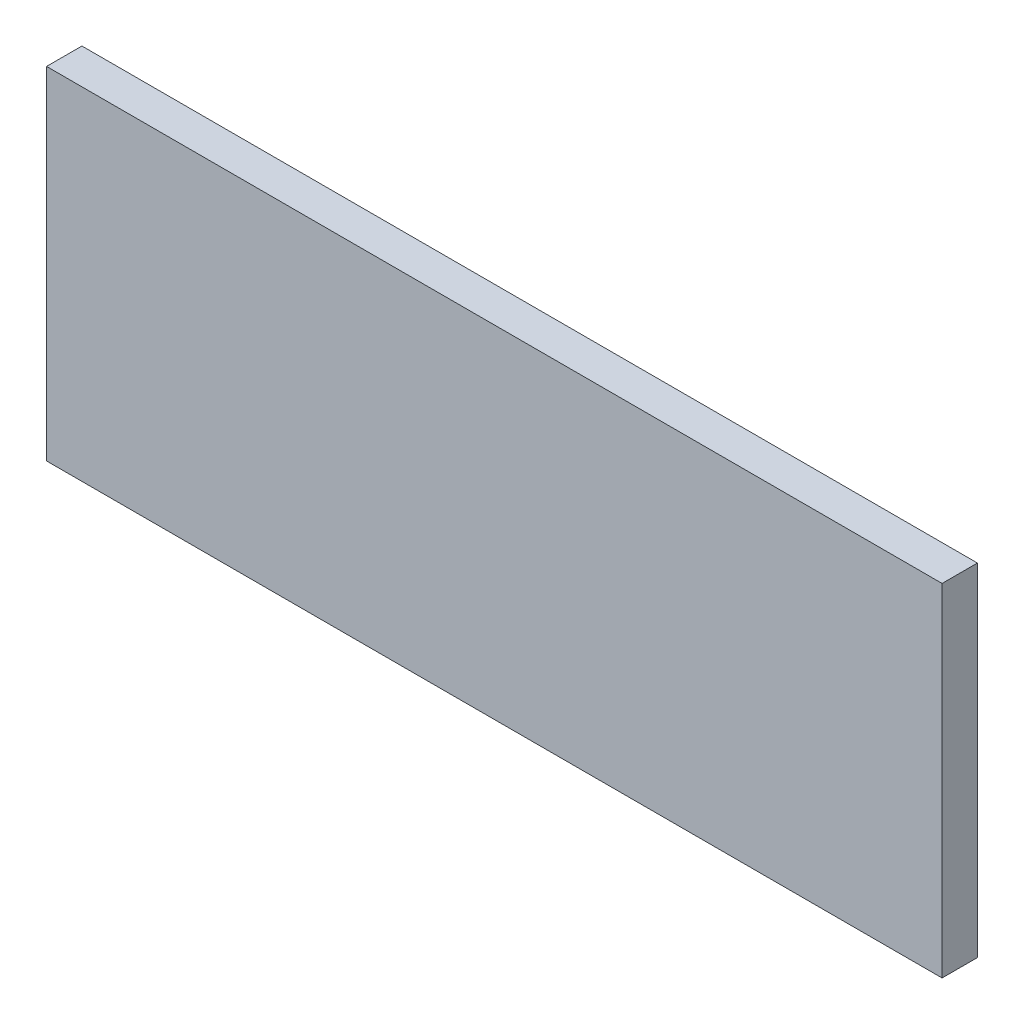
ISO-10303-21;
HEADER;
FILE_DESCRIPTION(('STEP AP214'),'2;1');
FILE_NAME('part.step','',(''),(''),'','','');
FILE_SCHEMA(('AUTOMOTIVE_DESIGN { 1 0 10303 214 1 1 1 1 }'));
ENDSEC;
DATA;
#1=APPLICATION_CONTEXT('core data for automotive mechanical design processes');
#2=APPLICATION_PROTOCOL_DEFINITION('international standard','automotive_design',2000,#1);
#3=PRODUCT_CONTEXT('',#1,'mechanical');
#4=PRODUCT('Part','Part','',(#3));
#5=PRODUCT_RELATED_PRODUCT_CATEGORY('part','',(#4));
#6=PRODUCT_DEFINITION_FORMATION('','',#4);
#7=PRODUCT_DEFINITION_CONTEXT('part definition',#1,'design');
#8=PRODUCT_DEFINITION('design','',#6,#7);
#9=PRODUCT_DEFINITION_SHAPE('','',#8);
#10=(LENGTH_UNIT() NAMED_UNIT(*) SI_UNIT(.MILLI.,.METRE.));
#11=(NAMED_UNIT(*) PLANE_ANGLE_UNIT() SI_UNIT($,.RADIAN.));
#12=(NAMED_UNIT(*) SI_UNIT($,.STERADIAN.) SOLID_ANGLE_UNIT());
#13=UNCERTAINTY_MEASURE_WITH_UNIT(LENGTH_MEASURE(1.E-05),#10,'distance_accuracy_value','');
#14=(GEOMETRIC_REPRESENTATION_CONTEXT(3) GLOBAL_UNCERTAINTY_ASSIGNED_CONTEXT((#13)) GLOBAL_UNIT_ASSIGNED_CONTEXT((#10,
#11,#12)) REPRESENTATION_CONTEXT('',''));
#15=CARTESIAN_POINT('',(0.,0.,0.));
#16=DIRECTION('',(0.,0.,1.));
#17=DIRECTION('',(1.,0.,0.));
#18=AXIS2_PLACEMENT_3D('',#15,#16,#17);
#19=CARTESIAN_POINT('',(0.,0.,19.05));
#20=DIRECTION('',(1.,0.,0.));
#21=DIRECTION('',(0.,0.,-1.));
#22=AXIS2_PLACEMENT_3D('',#19,#20,#21);
#23=PLANE('',#22);
#24=DIRECTION('',(0.,-1.,0.));
#25=VECTOR('',#24,1.);
#26=CARTESIAN_POINT('',(0.,0.,0.));
#27=LINE('',#26,#25);
#28=CARTESIAN_POINT('',(0.,184.15,0.));
#29=VERTEX_POINT('',#28);
#30=CARTESIAN_POINT('',(0.,0.,0.));
#31=VERTEX_POINT('',#30);
#32=EDGE_CURVE('E107',#29,#31,#27,.T.);
#33=ORIENTED_EDGE('',*,*,#32,.T.);
#34=DIRECTION('',(0.,0.,-1.));
#35=VECTOR('',#34,1.);
#36=CARTESIAN_POINT('',(0.,0.,19.05));
#37=LINE('',#36,#35);
#38=CARTESIAN_POINT('',(0.,0.,19.05));
#39=VERTEX_POINT('',#38);
#40=EDGE_CURVE('E11',#39,#31,#37,.T.);
#41=ORIENTED_EDGE('',*,*,#40,.F.);
#42=DIRECTION('',(0.,-1.,0.));
#43=VECTOR('',#42,1.);
#44=CARTESIAN_POINT('',(0.,0.,19.05));
#45=LINE('',#44,#43);
#46=CARTESIAN_POINT('',(0.,184.15,19.05));
#47=VERTEX_POINT('',#46);
#48=EDGE_CURVE('E91',#47,#39,#45,.T.);
#49=ORIENTED_EDGE('',*,*,#48,.F.);
#50=DIRECTION('',(0.,0.,-1.));
#51=VECTOR('',#50,1.);
#52=CARTESIAN_POINT('',(0.,184.15,19.05));
#53=LINE('',#52,#51);
#54=EDGE_CURVE('E103',#47,#29,#53,.T.);
#55=ORIENTED_EDGE('',*,*,#54,.T.);
#56=EDGE_LOOP('',(#33,#41,#49,#55));
#57=FACE_BOUND('',#56,.T.);
#58=ADVANCED_FACE('F39',(#57),#23,.F.);
#59=CARTESIAN_POINT('',(0.,0.,19.05));
#60=DIRECTION('',(0.,1.,0.));
#61=DIRECTION('',(0.,0.,1.));
#62=AXIS2_PLACEMENT_3D('',#59,#60,#61);
#63=PLANE('',#62);
#64=DIRECTION('',(1.,0.,0.));
#65=VECTOR('',#64,1.);
#66=CARTESIAN_POINT('',(0.,0.,0.));
#67=LINE('',#66,#65);
#68=CARTESIAN_POINT('',(482.6,0.,0.));
#69=VERTEX_POINT('',#68);
#70=EDGE_CURVE('E96',#31,#69,#67,.T.);
#71=ORIENTED_EDGE('',*,*,#70,.T.);
#72=DIRECTION('',(0.,0.,-1.));
#73=VECTOR('',#72,1.);
#74=CARTESIAN_POINT('',(482.6,0.,19.05));
#75=LINE('',#74,#73);
#76=CARTESIAN_POINT('',(482.6,0.,19.05));
#77=VERTEX_POINT('',#76);
#78=EDGE_CURVE('E48',#77,#69,#75,.T.);
#79=ORIENTED_EDGE('',*,*,#78,.F.);
#80=DIRECTION('',(1.,0.,0.));
#81=VECTOR('',#80,1.);
#82=CARTESIAN_POINT('',(0.,0.,19.05));
#83=LINE('',#82,#81);
#84=EDGE_CURVE('E86',#39,#77,#83,.T.);
#85=ORIENTED_EDGE('',*,*,#84,.F.);
#86=ORIENTED_EDGE('',*,*,#40,.T.);
#87=EDGE_LOOP('',(#71,#79,#85,#86));
#88=FACE_BOUND('',#87,.T.);
#89=ADVANCED_FACE('F95',(#88),#63,.F.);
#90=CARTESIAN_POINT('',(482.6,0.,19.05));
#91=DIRECTION('',(-1.,0.,0.));
#92=DIRECTION('',(0.,0.,1.));
#93=AXIS2_PLACEMENT_3D('',#90,#91,#92);
#94=PLANE('',#93);
#95=DIRECTION('',(0.,1.,0.));
#96=VECTOR('',#95,1.);
#97=CARTESIAN_POINT('',(482.6,0.,0.));
#98=LINE('',#97,#96);
#99=CARTESIAN_POINT('',(482.6,184.15,0.));
#100=VERTEX_POINT('',#99);
#101=EDGE_CURVE('E73',#69,#100,#98,.T.);
#102=ORIENTED_EDGE('',*,*,#101,.T.);
#103=DIRECTION('',(0.,0.,-1.));
#104=VECTOR('',#103,1.);
#105=CARTESIAN_POINT('',(482.6,184.15,19.05));
#106=LINE('',#105,#104);
#107=CARTESIAN_POINT('',(482.6,184.15,19.05));
#108=VERTEX_POINT('',#107);
#109=EDGE_CURVE('E98',#108,#100,#106,.T.);
#110=ORIENTED_EDGE('',*,*,#109,.F.);
#111=DIRECTION('',(0.,1.,0.));
#112=VECTOR('',#111,1.);
#113=CARTESIAN_POINT('',(482.6,0.,19.05));
#114=LINE('',#113,#112);
#115=EDGE_CURVE('E89',#77,#108,#114,.T.);
#116=ORIENTED_EDGE('',*,*,#115,.F.);
#117=ORIENTED_EDGE('',*,*,#78,.T.);
#118=EDGE_LOOP('',(#102,#110,#116,#117));
#119=FACE_BOUND('',#118,.T.);
#120=ADVANCED_FACE('F99',(#119),#94,.F.);
#121=CARTESIAN_POINT('',(0.,184.15,19.05));
#122=DIRECTION('',(0.,-1.,0.));
#123=DIRECTION('',(0.,0.,-1.));
#124=AXIS2_PLACEMENT_3D('',#121,#122,#123);
#125=PLANE('',#124);
#126=DIRECTION('',(-1.,0.,0.));
#127=VECTOR('',#126,1.);
#128=CARTESIAN_POINT('',(0.,184.15,0.));
#129=LINE('',#128,#127);
#130=EDGE_CURVE('E79',#100,#29,#129,.T.);
#131=ORIENTED_EDGE('',*,*,#130,.T.);
#132=ORIENTED_EDGE('',*,*,#54,.F.);
#133=DIRECTION('',(-1.,0.,0.));
#134=VECTOR('',#133,1.);
#135=CARTESIAN_POINT('',(0.,184.15,19.05));
#136=LINE('',#135,#134);
#137=EDGE_CURVE('E56',#108,#47,#136,.T.);
#138=ORIENTED_EDGE('',*,*,#137,.F.);
#139=ORIENTED_EDGE('',*,*,#109,.T.);
#140=EDGE_LOOP('',(#131,#132,#138,#139));
#141=FACE_BOUND('',#140,.T.);
#142=ADVANCED_FACE('F120',(#141),#125,.F.);
#143=CARTESIAN_POINT('',(0.,0.,19.05));
#144=DIRECTION('',(0.,0.,-1.));
#145=DIRECTION('',(-1.,0.,0.));
#146=AXIS2_PLACEMENT_3D('',#143,#144,#145);
#147=PLANE('',#146);
#148=ORIENTED_EDGE('',*,*,#48,.T.);
#149=ORIENTED_EDGE('',*,*,#84,.T.);
#150=ORIENTED_EDGE('',*,*,#115,.T.);
#151=ORIENTED_EDGE('',*,*,#137,.T.);
#152=EDGE_LOOP('',(#148,#149,#150,#151));
#153=FACE_BOUND('',#152,.T.);
#154=ADVANCED_FACE('F87',(#153),#147,.F.);
#155=CARTESIAN_POINT('',(0.,0.,0.));
#156=DIRECTION('',(0.,0.,-1.));
#157=DIRECTION('',(-1.,0.,0.));
#158=AXIS2_PLACEMENT_3D('',#155,#156,#157);
#159=PLANE('',#158);
#160=ORIENTED_EDGE('',*,*,#32,.F.);
#161=ORIENTED_EDGE('',*,*,#130,.F.);
#162=ORIENTED_EDGE('',*,*,#101,.F.);
#163=ORIENTED_EDGE('',*,*,#70,.F.);
#164=EDGE_LOOP('',(#160,#161,#162,#163));
#165=FACE_BOUND('',#164,.T.);
#166=ADVANCED_FACE('F123',(#165),#159,.T.);
#167=CLOSED_SHELL('',(#58,#89,#120,#142,#154,#166));
#168=MANIFOLD_SOLID_BREP('B2',#167);
#169=ADVANCED_BREP_SHAPE_REPRESENTATION('',(#18,#168),#14);
#170=SHAPE_DEFINITION_REPRESENTATION(#9,#169);
ENDSEC;
END-ISO-10303-21;
